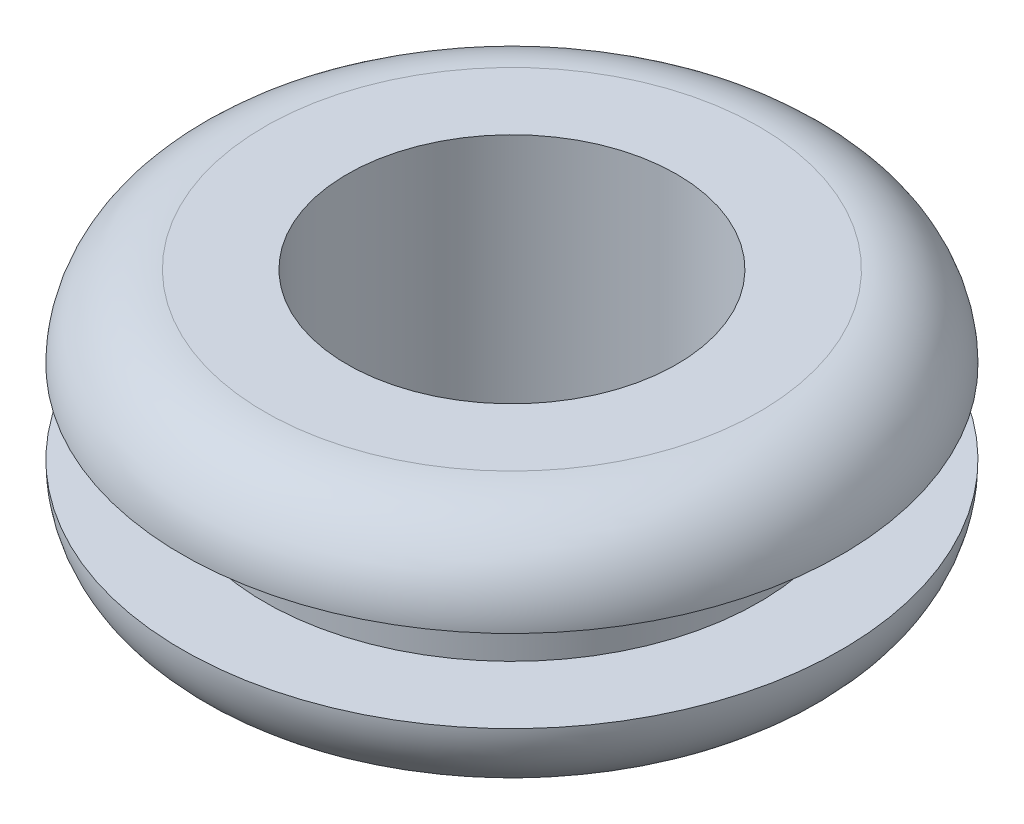
ISO-10303-21;
HEADER;
FILE_DESCRIPTION(('STEP AP214'),'2;1');
FILE_NAME('part.step','',(''),(''),'','','');
FILE_SCHEMA(('AUTOMOTIVE_DESIGN { 1 0 10303 214 1 1 1 1 }'));
ENDSEC;
DATA;
#1=APPLICATION_CONTEXT('core data for automotive mechanical design processes');
#2=APPLICATION_PROTOCOL_DEFINITION('international standard','automotive_design',2000,#1);
#3=PRODUCT_CONTEXT('',#1,'mechanical');
#4=PRODUCT('Part','Part','',(#3));
#5=PRODUCT_RELATED_PRODUCT_CATEGORY('part','',(#4));
#6=PRODUCT_DEFINITION_FORMATION('','',#4);
#7=PRODUCT_DEFINITION_CONTEXT('part definition',#1,'design');
#8=PRODUCT_DEFINITION('design','',#6,#7);
#9=PRODUCT_DEFINITION_SHAPE('','',#8);
#10=(LENGTH_UNIT() NAMED_UNIT(*) SI_UNIT(.MILLI.,.METRE.));
#11=(NAMED_UNIT(*) PLANE_ANGLE_UNIT() SI_UNIT($,.RADIAN.));
#12=(NAMED_UNIT(*) SI_UNIT($,.STERADIAN.) SOLID_ANGLE_UNIT());
#13=UNCERTAINTY_MEASURE_WITH_UNIT(LENGTH_MEASURE(1.E-05),#10,'distance_accuracy_value','');
#14=(GEOMETRIC_REPRESENTATION_CONTEXT(3) GLOBAL_UNCERTAINTY_ASSIGNED_CONTEXT((#13)) GLOBAL_UNIT_ASSIGNED_CONTEXT((#10,
#11,#12)) REPRESENTATION_CONTEXT('',''));
#15=CARTESIAN_POINT('',(0.,0.,0.));
#16=DIRECTION('',(0.,0.,1.));
#17=DIRECTION('',(1.,0.,0.));
#18=AXIS2_PLACEMENT_3D('',#15,#16,#17);
#19=CARTESIAN_POINT('',(0.,-2.38125,3.175));
#20=DIRECTION('',(0.,1.,0.));
#21=DIRECTION('',(0.,0.,1.));
#22=AXIS2_PLACEMENT_3D('',#19,#20,#21);
#23=PLANE('',#22);
#24=CARTESIAN_POINT('',(0.,-2.38125,0.));
#25=DIRECTION('',(0.,-1.,0.));
#26=DIRECTION('',(0.,0.,-1.));
#27=AXIS2_PLACEMENT_3D('',#24,#25,#26);
#28=CIRCLE('',#27,3.175);
#29=CARTESIAN_POINT('',(0.,-2.38125,-3.175));
#30=VERTEX_POINT('',#29);
#31=EDGE_CURVE('E12',#30,#30,#28,.T.);
#32=ORIENTED_EDGE('',*,*,#31,.F.);
#33=EDGE_LOOP('',(#32));
#34=FACE_BOUND('',#33,.T.);
#35=CARTESIAN_POINT('',(0.,-2.38125,0.));
#36=DIRECTION('',(0.,-1.,0.));
#37=DIRECTION('',(0.,0.,-1.));
#38=AXIS2_PLACEMENT_3D('',#35,#36,#37);
#39=CIRCLE('',#38,4.7625);
#40=CARTESIAN_POINT('',(0.,-2.38125,-4.7625));
#41=VERTEX_POINT('',#40);
#42=EDGE_CURVE('E70',#41,#41,#39,.T.);
#43=ORIENTED_EDGE('',*,*,#42,.T.);
#44=EDGE_LOOP('',(#43));
#45=FACE_BOUND('',#44,.T.);
#46=ADVANCED_FACE('F42',(#34,#45),#23,.F.);
#47=CARTESIAN_POINT('',(0.,-2.38125,0.));
#48=DIRECTION('',(0.,-1.,0.));
#49=DIRECTION('',(0.,0.,-1.));
#50=AXIS2_PLACEMENT_3D('',#47,#48,#49);
#51=CYLINDRICAL_SURFACE('',#50,3.175);
#52=CARTESIAN_POINT('',(0.,2.38125,0.));
#53=DIRECTION('',(0.,-1.,0.));
#54=DIRECTION('',(0.,0.,-1.));
#55=AXIS2_PLACEMENT_3D('',#52,#53,#54);
#56=CIRCLE('',#55,3.175);
#57=CARTESIAN_POINT('',(0.,2.38125,-3.175));
#58=VERTEX_POINT('',#57);
#59=EDGE_CURVE('E48',#58,#58,#56,.T.);
#60=ORIENTED_EDGE('',*,*,#59,.F.);
#61=EDGE_LOOP('',(#60));
#62=FACE_BOUND('',#61,.T.);
#63=ORIENTED_EDGE('',*,*,#31,.T.);
#64=EDGE_LOOP('',(#63));
#65=FACE_BOUND('',#64,.T.);
#66=ADVANCED_FACE('F107',(#62,#65),#51,.F.);
#67=CARTESIAN_POINT('',(0.,2.38125,3.175));
#68=DIRECTION('',(0.,-1.,0.));
#69=DIRECTION('',(0.,0.,-1.));
#70=AXIS2_PLACEMENT_3D('',#67,#68,#69);
#71=PLANE('',#70);
#72=CARTESIAN_POINT('',(0.,2.38125,0.));
#73=DIRECTION('',(0.,-1.,0.));
#74=DIRECTION('',(0.,0.,-1.));
#75=AXIS2_PLACEMENT_3D('',#72,#73,#74);
#76=CIRCLE('',#75,4.7625);
#77=CARTESIAN_POINT('',(0.,2.38125,-4.7625));
#78=VERTEX_POINT('',#77);
#79=EDGE_CURVE('E52',#78,#78,#76,.T.);
#80=ORIENTED_EDGE('',*,*,#79,.F.);
#81=EDGE_LOOP('',(#80));
#82=FACE_BOUND('',#81,.T.);
#83=ORIENTED_EDGE('',*,*,#59,.T.);
#84=EDGE_LOOP('',(#83));
#85=FACE_BOUND('',#84,.T.);
#86=ADVANCED_FACE('F102',(#82,#85),#71,.F.);
#87=CARTESIAN_POINT('',(0.,0.793750000000001,0.));
#88=DIRECTION('',(0.,-1.,0.));
#89=DIRECTION('',(0.,0.,-1.));
#90=AXIS2_PLACEMENT_3D('',#87,#88,#89);
#91=TOROIDAL_SURFACE('',#90,4.7625,1.5875);
#92=CARTESIAN_POINT('',(0.,0.793750000000001,0.));
#93=DIRECTION('',(0.,-1.,0.));
#94=DIRECTION('',(0.,0.,-1.));
#95=AXIS2_PLACEMENT_3D('',#92,#93,#94);
#96=CIRCLE('',#95,6.35);
#97=CARTESIAN_POINT('',(0.,0.793750000000001,-6.35));
#98=VERTEX_POINT('',#97);
#99=EDGE_CURVE('E56',#98,#98,#96,.T.);
#100=ORIENTED_EDGE('',*,*,#99,.F.);
#101=EDGE_LOOP('',(#100));
#102=FACE_BOUND('',#101,.T.);
#103=ORIENTED_EDGE('',*,*,#79,.T.);
#104=EDGE_LOOP('',(#103));
#105=FACE_BOUND('',#104,.T.);
#106=ADVANCED_FACE('F96',(#102,#105),#91,.T.);
#107=CARTESIAN_POINT('',(0.,0.79375,4.7625));
#108=DIRECTION('',(0.,1.,0.));
#109=DIRECTION('',(0.,0.,1.));
#110=AXIS2_PLACEMENT_3D('',#107,#108,#109);
#111=PLANE('',#110);
#112=CARTESIAN_POINT('',(0.,0.79375,0.));
#113=DIRECTION('',(0.,-1.,0.));
#114=DIRECTION('',(0.,0.,-1.));
#115=AXIS2_PLACEMENT_3D('',#112,#113,#114);
#116=CIRCLE('',#115,4.7625);
#117=CARTESIAN_POINT('',(0.,0.79375,-4.7625));
#118=VERTEX_POINT('',#117);
#119=EDGE_CURVE('E61',#118,#118,#116,.T.);
#120=ORIENTED_EDGE('',*,*,#119,.F.);
#121=EDGE_LOOP('',(#120));
#122=FACE_BOUND('',#121,.T.);
#123=ORIENTED_EDGE('',*,*,#99,.T.);
#124=EDGE_LOOP('',(#123));
#125=FACE_BOUND('',#124,.T.);
#126=ADVANCED_FACE('F90',(#122,#125),#111,.F.);
#127=CARTESIAN_POINT('',(0.,-2.38125,0.));
#128=DIRECTION('',(0.,-1.,0.));
#129=DIRECTION('',(0.,0.,-1.));
#130=AXIS2_PLACEMENT_3D('',#127,#128,#129);
#131=CYLINDRICAL_SURFACE('',#130,4.7625);
#132=CARTESIAN_POINT('',(0.,-0.79375,0.));
#133=DIRECTION('',(0.,-1.,0.));
#134=DIRECTION('',(0.,0.,-1.));
#135=AXIS2_PLACEMENT_3D('',#132,#133,#134);
#136=CIRCLE('',#135,4.7625);
#137=CARTESIAN_POINT('',(0.,-0.79375,-4.7625));
#138=VERTEX_POINT('',#137);
#139=EDGE_CURVE('E64',#138,#138,#136,.T.);
#140=ORIENTED_EDGE('',*,*,#139,.F.);
#141=EDGE_LOOP('',(#140));
#142=FACE_BOUND('',#141,.T.);
#143=ORIENTED_EDGE('',*,*,#119,.T.);
#144=EDGE_LOOP('',(#143));
#145=FACE_BOUND('',#144,.T.);
#146=ADVANCED_FACE('F84',(#142,#145),#131,.T.);
#147=CARTESIAN_POINT('',(0.,-0.79375,4.7625));
#148=DIRECTION('',(0.,-1.,0.));
#149=DIRECTION('',(0.,0.,-1.));
#150=AXIS2_PLACEMENT_3D('',#147,#148,#149);
#151=PLANE('',#150);
#152=CARTESIAN_POINT('',(0.,-0.79375,0.));
#153=DIRECTION('',(0.,-1.,0.));
#154=DIRECTION('',(0.,0.,-1.));
#155=AXIS2_PLACEMENT_3D('',#152,#153,#154);
#156=CIRCLE('',#155,6.35);
#157=CARTESIAN_POINT('',(0.,-0.79375,-6.35));
#158=VERTEX_POINT('',#157);
#159=EDGE_CURVE('E67',#158,#158,#156,.T.);
#160=ORIENTED_EDGE('',*,*,#159,.F.);
#161=EDGE_LOOP('',(#160));
#162=FACE_BOUND('',#161,.T.);
#163=ORIENTED_EDGE('',*,*,#139,.T.);
#164=EDGE_LOOP('',(#163));
#165=FACE_BOUND('',#164,.T.);
#166=ADVANCED_FACE('F78',(#162,#165),#151,.F.);
#167=CARTESIAN_POINT('',(0.,-0.793750000000001,0.));
#168=DIRECTION('',(0.,-1.,0.));
#169=DIRECTION('',(0.,0.,-1.));
#170=AXIS2_PLACEMENT_3D('',#167,#168,#169);
#171=TOROIDAL_SURFACE('',#170,4.7625,1.5875);
#172=ORIENTED_EDGE('',*,*,#42,.F.);
#173=EDGE_LOOP('',(#172));
#174=FACE_BOUND('',#173,.T.);
#175=ORIENTED_EDGE('',*,*,#159,.T.);
#176=EDGE_LOOP('',(#175));
#177=FACE_BOUND('',#176,.T.);
#178=ADVANCED_FACE('F75',(#174,#177),#171,.T.);
#179=CLOSED_SHELL('',(#46,#66,#86,#106,#126,#146,#166,#178));
#180=MANIFOLD_SOLID_BREP('B2',#179);
#181=ADVANCED_BREP_SHAPE_REPRESENTATION('',(#18,#180),#14);
#182=SHAPE_DEFINITION_REPRESENTATION(#9,#181);
ENDSEC;
END-ISO-10303-21;
